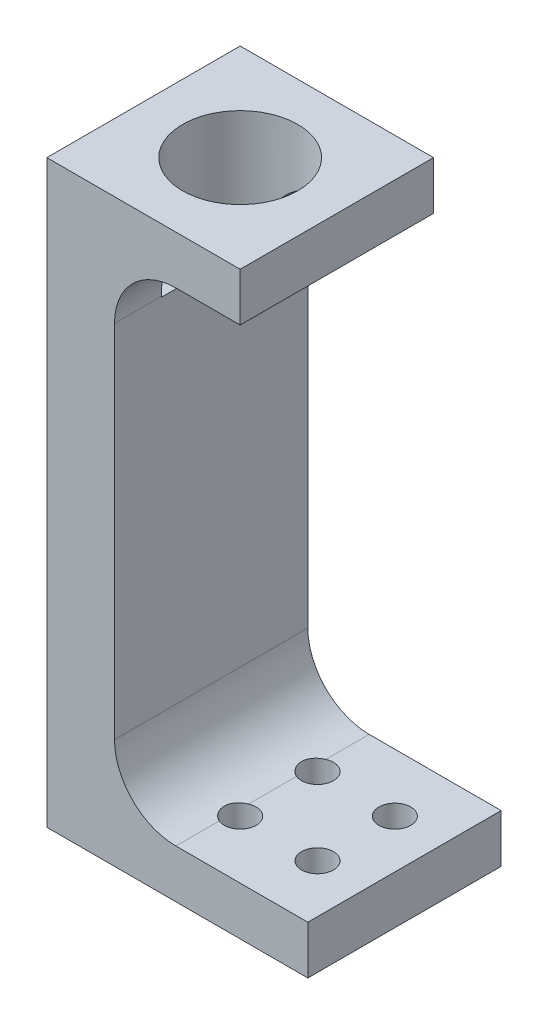
ISO-10303-21;
HEADER;
FILE_DESCRIPTION(('STEP AP214'),'2;1');
FILE_NAME('part.step','',(''),(''),'','','');
FILE_SCHEMA(('AUTOMOTIVE_DESIGN { 1 0 10303 214 1 1 1 1 }'));
ENDSEC;
DATA;
#1=APPLICATION_CONTEXT('core data for automotive mechanical design processes');
#2=APPLICATION_PROTOCOL_DEFINITION('international standard','automotive_design',2000,#1);
#3=PRODUCT_CONTEXT('',#1,'mechanical');
#4=PRODUCT('Part','Part','',(#3));
#5=PRODUCT_RELATED_PRODUCT_CATEGORY('part','',(#4));
#6=PRODUCT_DEFINITION_FORMATION('','',#4);
#7=PRODUCT_DEFINITION_CONTEXT('part definition',#1,'design');
#8=PRODUCT_DEFINITION('design','',#6,#7);
#9=PRODUCT_DEFINITION_SHAPE('','',#8);
#10=(LENGTH_UNIT() NAMED_UNIT(*) SI_UNIT(.MILLI.,.METRE.));
#11=(NAMED_UNIT(*) PLANE_ANGLE_UNIT() SI_UNIT($,.RADIAN.));
#12=(NAMED_UNIT(*) SI_UNIT($,.STERADIAN.) SOLID_ANGLE_UNIT());
#13=UNCERTAINTY_MEASURE_WITH_UNIT(LENGTH_MEASURE(1.E-05),#10,'distance_accuracy_value','');
#14=(GEOMETRIC_REPRESENTATION_CONTEXT(3) GLOBAL_UNCERTAINTY_ASSIGNED_CONTEXT((#13)) GLOBAL_UNIT_ASSIGNED_CONTEXT((#10,
#11,#12)) REPRESENTATION_CONTEXT('',''));
#15=CARTESIAN_POINT('',(0.,0.,0.));
#16=DIRECTION('',(0.,0.,1.));
#17=DIRECTION('',(1.,0.,0.));
#18=AXIS2_PLACEMENT_3D('',#15,#16,#17);
#19=CARTESIAN_POINT('',(7.,4.99999999999999,20.));
#20=DIRECTION('',(-1.,0.,0.));
#21=DIRECTION('',(0.,-1.,0.));
#22=AXIS2_PLACEMENT_3D('',#19,#20,#21);
#23=PLANE('',#22);
#24=DIRECTION('',(0.,1.,0.));
#25=VECTOR('',#24,1.);
#26=CARTESIAN_POINT('',(6.99999999999999,48.57,15.1456301548012));
#27=LINE('',#26,#25);
#28=CARTESIAN_POINT('',(6.99999999999999,48.65,15.1456301548012));
#29=VERTEX_POINT('',#28);
#30=CARTESIAN_POINT('',(6.99999999999999,48.57,15.1456301548012));
#31=VERTEX_POINT('',#30);
#32=EDGE_CURVE('E146',#29,#31,#27,.F.);
#33=ORIENTED_EDGE('',*,*,#32,.F.);
#34=DIRECTION('',(0.,0.,-1.));
#35=VECTOR('',#34,1.);
#36=CARTESIAN_POINT('',(6.99999999999999,48.65,20.));
#37=LINE('',#36,#35);
#38=CARTESIAN_POINT('',(6.99999999999999,48.65,20.));
#39=VERTEX_POINT('',#38);
#40=EDGE_CURVE('E241',#29,#39,#37,.F.);
#41=ORIENTED_EDGE('',*,*,#40,.T.);
#42=DIRECTION('',(0.,1.,0.));
#43=VECTOR('',#42,1.);
#44=CARTESIAN_POINT('',(7.,4.99999999999999,20.));
#45=LINE('',#44,#43);
#46=CARTESIAN_POINT('',(7.,11.35,20.));
#47=VERTEX_POINT('',#46);
#48=EDGE_CURVE('E198',#47,#39,#45,.T.);
#49=ORIENTED_EDGE('',*,*,#48,.F.);
#50=DIRECTION('',(0.,0.,-1.));
#51=VECTOR('',#50,1.);
#52=CARTESIAN_POINT('',(7.,11.35,0.));
#53=LINE('',#52,#51);
#54=CARTESIAN_POINT('',(7.,11.35,0.));
#55=VERTEX_POINT('',#54);
#56=EDGE_CURVE('E243',#47,#55,#53,.T.);
#57=ORIENTED_EDGE('',*,*,#56,.T.);
#58=DIRECTION('',(0.,1.,0.));
#59=VECTOR('',#58,1.);
#60=CARTESIAN_POINT('',(7.,4.99999999999999,0.));
#61=LINE('',#60,#59);
#62=CARTESIAN_POINT('',(6.99999999999999,48.65,0.));
#63=VERTEX_POINT('',#62);
#64=EDGE_CURVE('E217',#55,#63,#61,.T.);
#65=ORIENTED_EDGE('',*,*,#64,.T.);
#66=CARTESIAN_POINT('',(6.99999999999999,48.65,4.85436984519875));
#67=VERTEX_POINT('',#66);
#68=EDGE_CURVE('E163',#63,#67,#37,.F.);
#69=ORIENTED_EDGE('',*,*,#68,.T.);
#70=DIRECTION('',(0.,1.,0.));
#71=VECTOR('',#70,1.);
#72=CARTESIAN_POINT('',(6.99999999999999,48.57,4.85436984519875));
#73=LINE('',#72,#71);
#74=CARTESIAN_POINT('',(6.99999999999999,48.57,4.85436984519875));
#75=VERTEX_POINT('',#74);
#76=EDGE_CURVE('E154',#75,#67,#73,.T.);
#77=ORIENTED_EDGE('',*,*,#76,.F.);
#78=DIRECTION('',(0.,0.,1.));
#79=VECTOR('',#78,1.);
#80=CARTESIAN_POINT('',(6.99999999999999,48.57,20.));
#81=LINE('',#80,#79);
#82=EDGE_CURVE('E11',#75,#31,#81,.T.);
#83=ORIENTED_EDGE('',*,*,#82,.T.);
#84=EDGE_LOOP('',(#33,#41,#49,#57,#65,#69,#77,#83));
#85=FACE_BOUND('',#84,.T.);
#86=ADVANCED_FACE('F39',(#85),#23,.F.);
#87=CARTESIAN_POINT('',(6.99999999999998,55.,20.));
#88=DIRECTION('',(0.,1.,0.));
#89=DIRECTION('',(-1.,0.,0.));
#90=AXIS2_PLACEMENT_3D('',#87,#88,#89);
#91=PLANE('',#90);
#92=CARTESIAN_POINT('',(10.,55.,10.));
#93=DIRECTION('',(0.,1.,0.));
#94=DIRECTION('',(-1.,0.,0.));
#95=AXIS2_PLACEMENT_3D('',#92,#93,#94);
#96=CIRCLE('',#95,5.9563);
#97=CARTESIAN_POINT('',(13.35,55.,5.07506246841646));
#98=VERTEX_POINT('',#97);
#99=CARTESIAN_POINT('',(13.35,55.,14.9249375315835));
#100=VERTEX_POINT('',#99);
#101=EDGE_CURVE('E55',#98,#100,#96,.F.);
#102=ORIENTED_EDGE('',*,*,#101,.F.);
#103=DIRECTION('',(0.,0.,-1.));
#104=VECTOR('',#103,1.);
#105=CARTESIAN_POINT('',(13.35,55.,0.));
#106=LINE('',#105,#104);
#107=CARTESIAN_POINT('',(13.35,55.,0.));
#108=VERTEX_POINT('',#107);
#109=EDGE_CURVE('E250',#98,#108,#106,.T.);
#110=ORIENTED_EDGE('',*,*,#109,.T.);
#111=DIRECTION('',(1.,0.,0.));
#112=VECTOR('',#111,1.);
#113=CARTESIAN_POINT('',(6.99999999999998,55.,0.));
#114=LINE('',#113,#112);
#115=CARTESIAN_POINT('',(20.,55.,0.));
#116=VERTEX_POINT('',#115);
#117=EDGE_CURVE('E219',#108,#116,#114,.T.);
#118=ORIENTED_EDGE('',*,*,#117,.T.);
#119=DIRECTION('',(0.,0.,-1.));
#120=VECTOR('',#119,1.);
#121=CARTESIAN_POINT('',(20.,55.,20.));
#122=LINE('',#121,#120);
#123=CARTESIAN_POINT('',(20.,55.,20.));
#124=VERTEX_POINT('',#123);
#125=EDGE_CURVE('E229',#124,#116,#122,.T.);
#126=ORIENTED_EDGE('',*,*,#125,.F.);
#127=DIRECTION('',(1.,0.,0.));
#128=VECTOR('',#127,1.);
#129=CARTESIAN_POINT('',(6.99999999999998,55.,20.));
#130=LINE('',#129,#128);
#131=CARTESIAN_POINT('',(13.35,55.,20.));
#132=VERTEX_POINT('',#131);
#133=EDGE_CURVE('E201',#132,#124,#130,.T.);
#134=ORIENTED_EDGE('',*,*,#133,.F.);
#135=EDGE_CURVE('E252',#132,#100,#106,.T.);
#136=ORIENTED_EDGE('',*,*,#135,.T.);
#137=EDGE_LOOP('',(#102,#110,#118,#126,#134,#136));
#138=FACE_BOUND('',#137,.T.);
#139=ADVANCED_FACE('F299',(#138),#91,.F.);
#140=CARTESIAN_POINT('',(20.,60.,20.));
#141=DIRECTION('',(0.,-1.,0.));
#142=DIRECTION('',(1.,0.,0.));
#143=AXIS2_PLACEMENT_3D('',#140,#141,#142);
#144=PLANE('',#143);
#145=DIRECTION('',(-1.,0.,0.));
#146=VECTOR('',#145,1.);
#147=CARTESIAN_POINT('',(20.,60.,0.));
#148=LINE('',#147,#146);
#149=CARTESIAN_POINT('',(20.,60.,0.));
#150=VERTEX_POINT('',#149);
#151=CARTESIAN_POINT('',(0.,60.,0.));
#152=VERTEX_POINT('',#151);
#153=EDGE_CURVE('E191',#150,#152,#148,.T.);
#154=ORIENTED_EDGE('',*,*,#153,.T.);
#155=DIRECTION('',(0.,0.,-1.));
#156=VECTOR('',#155,1.);
#157=CARTESIAN_POINT('',(0.,60.,20.));
#158=LINE('',#157,#156);
#159=CARTESIAN_POINT('',(0.,60.,20.));
#160=VERTEX_POINT('',#159);
#161=EDGE_CURVE('E207',#160,#152,#158,.T.);
#162=ORIENTED_EDGE('',*,*,#161,.F.);
#163=DIRECTION('',(-1.,0.,0.));
#164=VECTOR('',#163,1.);
#165=CARTESIAN_POINT('',(20.,60.,20.));
#166=LINE('',#165,#164);
#167=CARTESIAN_POINT('',(20.,60.,20.));
#168=VERTEX_POINT('',#167);
#169=EDGE_CURVE('E205',#168,#160,#166,.T.);
#170=ORIENTED_EDGE('',*,*,#169,.F.);
#171=DIRECTION('',(0.,0.,-1.));
#172=VECTOR('',#171,1.);
#173=CARTESIAN_POINT('',(20.,60.,20.));
#174=LINE('',#173,#172);
#175=EDGE_CURVE('E226',#168,#150,#174,.T.);
#176=ORIENTED_EDGE('',*,*,#175,.T.);
#177=EDGE_LOOP('',(#154,#162,#170,#176));
#178=FACE_BOUND('',#177,.T.);
#179=CARTESIAN_POINT('',(10.,60.,10.));
#180=DIRECTION('',(0.,-1.,0.));
#181=DIRECTION('',(1.,0.,0.));
#182=AXIS2_PLACEMENT_3D('',#179,#180,#181);
#183=CIRCLE('',#182,5.9563);
#184=CARTESIAN_POINT('',(15.9563,60.,10.));
#185=VERTEX_POINT('',#184);
#186=EDGE_CURVE('E158',#185,#185,#183,.T.);
#187=ORIENTED_EDGE('',*,*,#186,.T.);
#188=EDGE_LOOP('',(#187));
#189=FACE_BOUND('',#188,.T.);
#190=ADVANCED_FACE('F296',(#178,#189),#144,.F.);
#191=CARTESIAN_POINT('',(13.35,48.65,20.));
#192=DIRECTION('',(0.,0.,1.));
#193=DIRECTION('',(1.,0.,0.));
#194=AXIS2_PLACEMENT_3D('',#191,#192,#193);
#195=CYLINDRICAL_SURFACE('',#194,6.35);
#196=CARTESIAN_POINT('',(6.99999999999999,48.65,4.85436984519875));
#197=CARTESIAN_POINT('',(6.9999992818069,48.734454480183,4.85437382577386));
#198=CARTESIAN_POINT('',(7.00168521334198,48.8188965864689,4.85338691640093));
#199=CARTESIAN_POINT('',(7.00841859388008,48.9875958779938,4.8494687045629));
#200=CARTESIAN_POINT('',(7.01346581401016,49.0718530754316,4.84653753448419));
#201=CARTESIAN_POINT('',(7.03361686742175,49.3239340088723,4.83489229298772));
#202=CARTESIAN_POINT('',(7.05373015348571,49.4912589255421,4.82332632552397));
#203=CARTESIAN_POINT('',(7.10687434563199,49.8220868973223,4.79344204231649));
#204=CARTESIAN_POINT('',(7.13982206507667,49.9856075190962,4.7751672529984));
#205=CARTESIAN_POINT('',(7.21825854542084,50.3088917354404,4.73298904051804));
#206=CARTESIAN_POINT('',(7.26374977243069,50.4686545845053,4.70908451065825));
#207=CARTESIAN_POINT('',(7.36668367067238,50.782998671125,4.65711119202545));
#208=CARTESIAN_POINT('',(7.42408738025659,50.9375949391291,4.62905606224884));
#209=CARTESIAN_POINT('',(7.55048283558707,51.2413697435556,4.5702451525967));
#210=CARTESIAN_POINT('',(7.61947421940112,51.3905484490144,4.53948945708561));
#211=CARTESIAN_POINT('',(7.84373612325595,51.8298907184806,4.44533189534096));
#212=CARTESIAN_POINT('',(8.01610076559751,52.1112719198209,4.38014754637957));
#213=CARTESIAN_POINT('',(8.31559118238781,52.5242699177789,4.28574875498484));
#214=CARTESIAN_POINT('',(8.42802291932234,52.6661617167889,4.25357824125725));
#215=CARTESIAN_POINT('',(8.66511880533711,52.9403582608421,4.19392359825515));
#216=CARTESIAN_POINT('',(8.78977604980311,53.0726683447891,4.16643684746755));
#217=CARTESIAN_POINT('',(9.05046554884871,53.3264899193993,4.11838144502198));
#218=CARTESIAN_POINT('',(9.18647856172476,53.4480189849129,4.09780137598122));
#219=CARTESIAN_POINT('',(9.46910842533944,53.6793621164603,4.06570453008208));
#220=CARTESIAN_POINT('',(9.61572070097367,53.7891811869736,4.05418386799323));
#221=CARTESIAN_POINT('',(9.87712368402315,53.9678435000316,4.04394602934627));
#222=CARTESIAN_POINT('',(9.98975236189021,54.039718829302,4.0426026792437));
#223=CARTESIAN_POINT('',(10.2192214109353,54.1761676910057,4.04663039633971));
#224=CARTESIAN_POINT('',(10.3360607461816,54.2407430034773,4.05199982282513));
#225=CARTESIAN_POINT('',(10.5730406303461,54.3621545516148,4.07013953411893));
#226=CARTESIAN_POINT('',(10.6931787747318,54.4189962533814,4.08290455782465));
#227=CARTESIAN_POINT('',(10.9358491683956,54.5246819626474,4.11640449964877));
#228=CARTESIAN_POINT('',(11.0583814333875,54.5735259176341,4.13713947009435));
#229=CARTESIAN_POINT('',(11.3051530550616,54.6631849806003,4.18708459611786));
#230=CARTESIAN_POINT('',(11.4293968465244,54.7039717712157,4.2163237806148));
#231=CARTESIAN_POINT('',(11.6779841797432,54.7772879711057,4.28349265920988));
#232=CARTESIAN_POINT('',(11.8023277284144,54.809816747291,4.32142301918102));
#233=CARTESIAN_POINT('',(12.0499197149432,54.8667863964496,4.40603386067028));
#234=CARTESIAN_POINT('',(12.173167860181,54.8912251679658,4.45271661078145));
#235=CARTESIAN_POINT('',(12.4173272749561,54.9323521653639,4.55467709352206));
#236=CARTESIAN_POINT('',(12.5382392843055,54.9490428847888,4.60995205327936));
#237=CARTESIAN_POINT('',(12.7770495869897,54.9752422496074,4.72900939383525));
#238=CARTESIAN_POINT('',(12.8949376407935,54.9847289841821,4.79281704004379));
#239=CARTESIAN_POINT('',(13.1260732991677,54.997107382183,4.92820121553793));
#240=CARTESIAN_POINT('',(13.2393332857689,55.0000179530465,4.99975485074903));
#241=CARTESIAN_POINT('',(13.35,55.,5.07506246841646));
#242=B_SPLINE_CURVE_WITH_KNOTS('',3,(#196,#197,#198,#199,#200,#201,#202,#203,#204,#205,#206,
#207,#208,#209,#210,#211,#212,#213,#214,#215,#216,#217,#218,#219,#220,#221,#222,#223,#224,#225,
#226,#227,#228,#229,#230,#231,#232,#233,#234,#235,#236,#237,#238,#239,#240,#241),.UNSPECIFIED.,
.F.,.F.,(4,2,2,2,2,2,2,2,2,2,2,2,2,2,2,2,2,2,2,2,2,2,4),(0.,0.253316575456899,0.506615904140768,
1.0126412431812,1.51543992576807,2.01833753142284,2.51961554696975,3.02087790838916,
4.02527057063263,4.57633949443016,5.12709896328156,5.67694343881885,6.22655197845441,
6.62700548345487,7.02736113015535,7.42743231972265,7.82750613602755,8.2289619513529,
8.63044853444076,9.03203932586536,9.43350078421848,9.83617844472714,10.237696866458),.UNSPECIFIED.);
#243=EDGE_CURVE('E48',#67,#98,#242,.T.);
#244=ORIENTED_EDGE('',*,*,#243,.F.);
#245=ORIENTED_EDGE('',*,*,#68,.F.);
#246=CARTESIAN_POINT('',(13.35,48.65,0.));
#247=DIRECTION('',(0.,0.,1.));
#248=DIRECTION('',(1.,0.,0.));
#249=AXIS2_PLACEMENT_3D('',#246,#247,#248);
#250=CIRCLE('',#249,6.35);
#251=EDGE_CURVE('E259',#108,#63,#250,.T.);
#252=ORIENTED_EDGE('',*,*,#251,.F.);
#253=ORIENTED_EDGE('',*,*,#109,.F.);
#254=EDGE_LOOP('',(#244,#245,#252,#253));
#255=FACE_BOUND('',#254,.T.);
#256=ADVANCED_FACE('F41',(#255),#195,.F.);
#257=CARTESIAN_POINT('',(13.35,55.,14.9249375315835));
#258=CARTESIAN_POINT('',(13.2417949174794,55.0000162019935,14.9985678116028));
#259=CARTESIAN_POINT('',(13.1311134026766,54.9972345918233,15.0686104817718));
#260=CARTESIAN_POINT('',(12.9055901612611,54.9854322347202,15.2011630689163));
#261=CARTESIAN_POINT('',(12.7907466923462,54.9764088455465,15.263669782642));
#262=CARTESIAN_POINT('',(12.55793885043,54.9514947506645,15.3806527279947));
#263=CARTESIAN_POINT('',(12.4399787915691,54.9356131143532,15.4351394381821));
#264=CARTESIAN_POINT('',(12.2018144356329,54.8964970386236,15.5359040125943));
#265=CARTESIAN_POINT('',(12.0816105565694,54.8732639561269,15.5821833892617));
#266=CARTESIAN_POINT('',(11.8396412374644,54.8190142263409,15.6665420182595));
#267=CARTESIAN_POINT('',(11.717872083633,54.7879734088744,15.7045951116447));
#268=CARTESIAN_POINT('',(11.474284801046,54.7179692699601,15.7723458215646));
#269=CARTESIAN_POINT('',(11.3524666713091,54.6790057809578,15.8020432613561));
#270=CARTESIAN_POINT('',(11.1100174659119,54.5931894782194,15.8532649989088));
#271=CARTESIAN_POINT('',(10.9893854981637,54.5463431648759,15.8747959837317));
#272=CARTESIAN_POINT('',(10.7502777686248,54.4448954133534,15.9100930899273));
#273=CARTESIAN_POINT('',(10.6318019617612,54.3902941374967,15.9238593737961));
#274=CARTESIAN_POINT('',(10.4008815793871,54.2750714518228,15.9438957672316));
#275=CARTESIAN_POINT('',(10.288360273245,54.2146344514353,15.950344506248));
#276=CARTESIAN_POINT('',(10.0670185167519,54.0869918700337,15.9569534528279));
#277=CARTESIAN_POINT('',(9.95819927744278,54.0197841020719,15.9571116219757));
#278=CARTESIAN_POINT('',(9.63823344218495,53.8085370455451,15.9491256743923));
#279=CARTESIAN_POINT('',(9.43354787647312,53.6548585981865,15.9325234091887));
#280=CARTESIAN_POINT('',(9.02141167806378,53.3048685302846,15.8794830915766));
#281=CARTESIAN_POINT('',(8.81675672792482,53.1056341806975,15.8408435280425));
#282=CARTESIAN_POINT('',(8.43705609531787,52.6831553758961,15.7508989996484));
#283=CARTESIAN_POINT('',(8.26204097928048,52.4598865181385,15.6995810925449));
#284=CARTESIAN_POINT('',(7.91198591370131,51.9462369520259,15.5819560217847));
#285=CARTESIAN_POINT('',(7.74382175067395,51.6513271113247,15.5146943496053));
#286=CARTESIAN_POINT('',(7.52816949881339,51.1911660344398,15.4197535027577));
#287=CARTESIAN_POINT('',(7.46238882162065,51.0348282927673,15.3891010663744));
#288=CARTESIAN_POINT('',(7.34337654489241,50.7168211236099,15.3314383478984));
#289=CARTESIAN_POINT('',(7.2901383876934,50.5551545328588,15.3044261657309));
#290=CARTESIAN_POINT('',(7.20342606481345,50.2510593340629,15.259155792072));
#291=CARTESIAN_POINT('',(7.16820716202913,50.1092294095419,15.2401965692966));
#292=CARTESIAN_POINT('',(7.10756036662683,49.8229650172745,15.2069657921929));
#293=CARTESIAN_POINT('',(7.08213045788458,49.6785310922654,15.1926932726885));
#294=CARTESIAN_POINT('',(7.04122809045242,49.3872803209051,15.1695036115901));
#295=CARTESIAN_POINT('',(7.02579266665307,49.2404566552615,15.1606063964189));
#296=CARTESIAN_POINT('',(7.00516570869564,48.9457625093556,15.1486409423826));
#297=CARTESIAN_POINT('',(6.99998083987864,48.7978914106724,15.145576496277));
#298=CARTESIAN_POINT('',(6.99999999999998,48.65,15.1456301548013));
#299=B_SPLINE_CURVE_WITH_KNOTS('',3,(#257,#258,#259,#260,#261,#262,#263,#264,#265,#266,#267,
#268,#269,#270,#271,#272,#273,#274,#275,#276,#277,#278,#279,#280,#281,#282,#283,#284,#285,#286,
#287,#288,#289,#290,#291,#292,#293,#294,#295,#296,#297,#298),.UNSPECIFIED.,.F.,.F.,(4,2,2,2,2,2,
2,2,2,2,2,2,2,2,2,2,2,2,2,2,4),(0.,0.392584493478463,0.785335275786889,1.17756826442515,
1.56972889732697,1.96311880190909,2.35651702705993,2.74959242095531,3.14265958844043,
3.52590994817343,3.90928449651873,4.67593099230418,5.53750267217242,6.39995751797447,
7.43341989189718,7.95005518142611,8.46641975370698,8.90811457084752,9.34971836855322,
9.79294931818256,10.2364683805113),.UNSPECIFIED.);
#300=EDGE_CURVE('E151',#100,#29,#299,.T.);
#301=ORIENTED_EDGE('',*,*,#300,.F.);
#302=ORIENTED_EDGE('',*,*,#135,.F.);
#303=CARTESIAN_POINT('',(13.35,48.65,20.));
#304=DIRECTION('',(0.,0.,1.));
#305=DIRECTION('',(1.,0.,0.));
#306=AXIS2_PLACEMENT_3D('',#303,#304,#305);
#307=CIRCLE('',#306,6.35);
#308=EDGE_CURVE('E261',#39,#132,#307,.F.);
#309=ORIENTED_EDGE('',*,*,#308,.F.);
#310=ORIENTED_EDGE('',*,*,#40,.F.);
#311=EDGE_LOOP('',(#301,#302,#309,#310));
#312=FACE_BOUND('',#311,.T.);
#313=ADVANCED_FACE('F322',(#312),#195,.F.);
#314=CARTESIAN_POINT('',(0.,60.,20.));
#315=DIRECTION('',(1.,0.,0.));
#316=DIRECTION('',(0.,0.,-1.));
#317=AXIS2_PLACEMENT_3D('',#314,#315,#316);
#318=PLANE('',#317);
#319=DIRECTION('',(0.,-1.,0.));
#320=VECTOR('',#319,1.);
#321=CARTESIAN_POINT('',(0.,60.,0.));
#322=LINE('',#321,#320);
#323=CARTESIAN_POINT('',(0.,0.,0.));
#324=VERTEX_POINT('',#323);
#325=EDGE_CURVE('E186',#152,#324,#322,.T.);
#326=ORIENTED_EDGE('',*,*,#325,.T.);
#327=DIRECTION('',(0.,0.,-1.));
#328=VECTOR('',#327,1.);
#329=CARTESIAN_POINT('',(0.,0.,20.));
#330=LINE('',#329,#328);
#331=CARTESIAN_POINT('',(0.,0.,20.));
#332=VERTEX_POINT('',#331);
#333=EDGE_CURVE('E238',#332,#324,#330,.T.);
#334=ORIENTED_EDGE('',*,*,#333,.F.);
#335=DIRECTION('',(0.,-1.,0.));
#336=VECTOR('',#335,1.);
#337=CARTESIAN_POINT('',(0.,60.,20.));
#338=LINE('',#337,#336);
#339=EDGE_CURVE('E187',#160,#332,#338,.T.);
#340=ORIENTED_EDGE('',*,*,#339,.F.);
#341=ORIENTED_EDGE('',*,*,#161,.T.);
#342=EDGE_LOOP('',(#326,#334,#340,#341));
#343=FACE_BOUND('',#342,.T.);
#344=ADVANCED_FACE('F319',(#343),#318,.F.);
#345=CARTESIAN_POINT('',(0.,0.,20.));
#346=DIRECTION('',(0.,1.,0.));
#347=DIRECTION('',(0.,0.,1.));
#348=AXIS2_PLACEMENT_3D('',#345,#346,#347);
#349=PLANE('',#348);
#350=CARTESIAN_POINT('',(22.,0.,14.));
#351=DIRECTION('',(0.,-1.,0.));
#352=DIRECTION('',(0.,0.,-1.));
#353=AXIS2_PLACEMENT_3D('',#350,#351,#352);
#354=CIRCLE('',#353,1.64999999999999);
#355=CARTESIAN_POINT('',(22.,0.,12.35));
#356=VERTEX_POINT('',#355);
#357=EDGE_CURVE('E165',#356,#356,#354,.T.);
#358=ORIENTED_EDGE('',*,*,#357,.F.);
#359=EDGE_LOOP('',(#358));
#360=FACE_BOUND('',#359,.T.);
#361=CARTESIAN_POINT('',(22.,0.,6.));
#362=DIRECTION('',(0.,-1.,0.));
#363=DIRECTION('',(0.,0.,-1.));
#364=AXIS2_PLACEMENT_3D('',#361,#362,#363);
#365=CIRCLE('',#364,1.64999999999999);
#366=CARTESIAN_POINT('',(22.,0.,4.35000000000001));
#367=VERTEX_POINT('',#366);
#368=EDGE_CURVE('E172',#367,#367,#365,.T.);
#369=ORIENTED_EDGE('',*,*,#368,.F.);
#370=EDGE_LOOP('',(#369));
#371=FACE_BOUND('',#370,.T.);
#372=CARTESIAN_POINT('',(14.,0.,6.));
#373=DIRECTION('',(0.,-1.,0.));
#374=DIRECTION('',(0.,0.,-1.));
#375=AXIS2_PLACEMENT_3D('',#372,#373,#374);
#376=CIRCLE('',#375,1.64999999999999);
#377=CARTESIAN_POINT('',(14.,0.,4.35000000000001));
#378=VERTEX_POINT('',#377);
#379=EDGE_CURVE('E176',#378,#378,#376,.T.);
#380=ORIENTED_EDGE('',*,*,#379,.F.);
#381=EDGE_LOOP('',(#380));
#382=FACE_BOUND('',#381,.T.);
#383=CARTESIAN_POINT('',(14.,0.,14.));
#384=DIRECTION('',(0.,-1.,0.));
#385=DIRECTION('',(0.,0.,-1.));
#386=AXIS2_PLACEMENT_3D('',#383,#384,#385);
#387=CIRCLE('',#386,1.64999999999999);
#388=CARTESIAN_POINT('',(14.,0.,12.35));
#389=VERTEX_POINT('',#388);
#390=EDGE_CURVE('E180',#389,#389,#387,.T.);
#391=ORIENTED_EDGE('',*,*,#390,.F.);
#392=EDGE_LOOP('',(#391));
#393=FACE_BOUND('',#392,.T.);
#394=DIRECTION('',(1.,0.,0.));
#395=VECTOR('',#394,1.);
#396=CARTESIAN_POINT('',(0.,0.,0.));
#397=LINE('',#396,#395);
#398=CARTESIAN_POINT('',(27.,0.,0.));
#399=VERTEX_POINT('',#398);
#400=EDGE_CURVE('E210',#324,#399,#397,.T.);
#401=ORIENTED_EDGE('',*,*,#400,.T.);
#402=DIRECTION('',(0.,0.,-1.));
#403=VECTOR('',#402,1.);
#404=CARTESIAN_POINT('',(27.,0.,20.));
#405=LINE('',#404,#403);
#406=CARTESIAN_POINT('',(27.,0.,20.));
#407=VERTEX_POINT('',#406);
#408=EDGE_CURVE('E235',#407,#399,#405,.T.);
#409=ORIENTED_EDGE('',*,*,#408,.F.);
#410=DIRECTION('',(1.,0.,0.));
#411=VECTOR('',#410,1.);
#412=CARTESIAN_POINT('',(0.,0.,20.));
#413=LINE('',#412,#411);
#414=EDGE_CURVE('E190',#332,#407,#413,.T.);
#415=ORIENTED_EDGE('',*,*,#414,.F.);
#416=ORIENTED_EDGE('',*,*,#333,.T.);
#417=EDGE_LOOP('',(#401,#409,#415,#416));
#418=FACE_BOUND('',#417,.T.);
#419=ADVANCED_FACE('F316',(#360,#371,#382,#393,#418),#349,.F.);
#420=CARTESIAN_POINT('',(27.,0.,20.));
#421=DIRECTION('',(-1.,0.,0.));
#422=DIRECTION('',(0.,-1.,0.));
#423=AXIS2_PLACEMENT_3D('',#420,#421,#422);
#424=PLANE('',#423);
#425=DIRECTION('',(0.,1.,0.));
#426=VECTOR('',#425,1.);
#427=CARTESIAN_POINT('',(27.,0.,0.));
#428=LINE('',#427,#426);
#429=CARTESIAN_POINT('',(27.,5.,0.));
#430=VERTEX_POINT('',#429);
#431=EDGE_CURVE('E212',#399,#430,#428,.T.);
#432=ORIENTED_EDGE('',*,*,#431,.T.);
#433=DIRECTION('',(0.,0.,-1.));
#434=VECTOR('',#433,1.);
#435=CARTESIAN_POINT('',(27.,5.,20.));
#436=LINE('',#435,#434);
#437=CARTESIAN_POINT('',(27.,5.,20.));
#438=VERTEX_POINT('',#437);
#439=EDGE_CURVE('E232',#438,#430,#436,.T.);
#440=ORIENTED_EDGE('',*,*,#439,.F.);
#441=DIRECTION('',(0.,1.,0.));
#442=VECTOR('',#441,1.);
#443=CARTESIAN_POINT('',(27.,0.,20.));
#444=LINE('',#443,#442);
#445=EDGE_CURVE('E193',#407,#438,#444,.T.);
#446=ORIENTED_EDGE('',*,*,#445,.F.);
#447=ORIENTED_EDGE('',*,*,#408,.T.);
#448=EDGE_LOOP('',(#432,#440,#446,#447));
#449=FACE_BOUND('',#448,.T.);
#450=ADVANCED_FACE('F312',(#449),#424,.F.);
#451=CARTESIAN_POINT('',(27.,5.,20.));
#452=DIRECTION('',(0.,-1.,0.));
#453=DIRECTION('',(1.,0.,0.));
#454=AXIS2_PLACEMENT_3D('',#451,#452,#453);
#455=PLANE('',#454);
#456=CARTESIAN_POINT('',(22.,5.,14.));
#457=DIRECTION('',(0.,-1.,0.));
#458=DIRECTION('',(1.,0.,0.));
#459=AXIS2_PLACEMENT_3D('',#456,#457,#458);
#460=CIRCLE('',#459,1.65);
#461=CARTESIAN_POINT('',(23.65,5.,14.));
#462=VERTEX_POINT('',#461);
#463=EDGE_CURVE('E168',#462,#462,#460,.T.);
#464=ORIENTED_EDGE('',*,*,#463,.T.);
#465=EDGE_LOOP('',(#464));
#466=FACE_BOUND('',#465,.T.);
#467=CARTESIAN_POINT('',(22.,5.,6.));
#468=DIRECTION('',(0.,-1.,0.));
#469=DIRECTION('',(1.,0.,0.));
#470=AXIS2_PLACEMENT_3D('',#467,#468,#469);
#471=CIRCLE('',#470,1.65);
#472=CARTESIAN_POINT('',(23.65,5.,6.));
#473=VERTEX_POINT('',#472);
#474=EDGE_CURVE('E175',#473,#473,#471,.T.);
#475=ORIENTED_EDGE('',*,*,#474,.T.);
#476=EDGE_LOOP('',(#475));
#477=FACE_BOUND('',#476,.T.);
#478=DIRECTION('',(0.,0.,-1.));
#479=VECTOR('',#478,1.);
#480=CARTESIAN_POINT('',(13.35,5.,20.));
#481=LINE('',#480,#479);
#482=CARTESIAN_POINT('',(13.35,5.,0.));
#483=VERTEX_POINT('',#482);
#484=CARTESIAN_POINT('',(13.35,5.,4.4834249111897));
#485=VERTEX_POINT('',#484);
#486=EDGE_CURVE('E247',#483,#485,#481,.F.);
#487=ORIENTED_EDGE('',*,*,#486,.T.);
#488=CARTESIAN_POINT('',(14.,5.,6.));
#489=DIRECTION('',(0.,-1.,0.));
#490=DIRECTION('',(1.,0.,0.));
#491=AXIS2_PLACEMENT_3D('',#488,#489,#490);
#492=CIRCLE('',#491,1.65);
#493=CARTESIAN_POINT('',(13.35,5.,7.5165750888103));
#494=VERTEX_POINT('',#493);
#495=EDGE_CURVE('E62',#485,#494,#492,.T.);
#496=ORIENTED_EDGE('',*,*,#495,.T.);
#497=CARTESIAN_POINT('',(13.35,5.,12.4834249111897));
#498=VERTEX_POINT('',#497);
#499=EDGE_CURVE('E251',#494,#498,#481,.F.);
#500=ORIENTED_EDGE('',*,*,#499,.T.);
#501=CARTESIAN_POINT('',(14.,5.,14.));
#502=DIRECTION('',(0.,-1.,0.));
#503=DIRECTION('',(1.,0.,0.));
#504=AXIS2_PLACEMENT_3D('',#501,#502,#503);
#505=CIRCLE('',#504,1.65);
#506=CARTESIAN_POINT('',(13.35,5.,15.5165750888103));
#507=VERTEX_POINT('',#506);
#508=EDGE_CURVE('E183',#498,#507,#505,.T.);
#509=ORIENTED_EDGE('',*,*,#508,.T.);
#510=CARTESIAN_POINT('',(13.35,5.,20.));
#511=VERTEX_POINT('',#510);
#512=EDGE_CURVE('E246',#507,#511,#481,.F.);
#513=ORIENTED_EDGE('',*,*,#512,.T.);
#514=DIRECTION('',(-1.,0.,0.));
#515=VECTOR('',#514,1.);
#516=CARTESIAN_POINT('',(27.,5.,20.));
#517=LINE('',#516,#515);
#518=EDGE_CURVE('E195',#438,#511,#517,.T.);
#519=ORIENTED_EDGE('',*,*,#518,.F.);
#520=ORIENTED_EDGE('',*,*,#439,.T.);
#521=DIRECTION('',(-1.,0.,0.));
#522=VECTOR('',#521,1.);
#523=CARTESIAN_POINT('',(27.,5.,0.));
#524=LINE('',#523,#522);
#525=EDGE_CURVE('E214',#430,#483,#524,.T.);
#526=ORIENTED_EDGE('',*,*,#525,.T.);
#527=EDGE_LOOP('',(#487,#496,#500,#509,#513,#519,#520,#526));
#528=FACE_BOUND('',#527,.T.);
#529=ADVANCED_FACE('F303',(#466,#477,#528),#455,.F.);
#530=CARTESIAN_POINT('',(20.,55.,20.));
#531=DIRECTION('',(-1.,0.,0.));
#532=DIRECTION('',(0.,-1.,0.));
#533=AXIS2_PLACEMENT_3D('',#530,#531,#532);
#534=PLANE('',#533);
#535=DIRECTION('',(0.,1.,0.));
#536=VECTOR('',#535,1.);
#537=CARTESIAN_POINT('',(20.,55.,0.));
#538=LINE('',#537,#536);
#539=EDGE_CURVE('E221',#116,#150,#538,.T.);
#540=ORIENTED_EDGE('',*,*,#539,.T.);
#541=ORIENTED_EDGE('',*,*,#175,.F.);
#542=DIRECTION('',(0.,1.,0.));
#543=VECTOR('',#542,1.);
#544=CARTESIAN_POINT('',(20.,55.,20.));
#545=LINE('',#544,#543);
#546=EDGE_CURVE('E203',#124,#168,#545,.T.);
#547=ORIENTED_EDGE('',*,*,#546,.F.);
#548=ORIENTED_EDGE('',*,*,#125,.T.);
#549=EDGE_LOOP('',(#540,#541,#547,#548));
#550=FACE_BOUND('',#549,.T.);
#551=ADVANCED_FACE('F291',(#550),#534,.F.);
#552=CARTESIAN_POINT('',(0.,0.,20.));
#553=DIRECTION('',(0.,0.,1.));
#554=DIRECTION('',(1.,0.,0.));
#555=AXIS2_PLACEMENT_3D('',#552,#553,#554);
#556=PLANE('',#555);
#557=ORIENTED_EDGE('',*,*,#339,.T.);
#558=ORIENTED_EDGE('',*,*,#414,.T.);
#559=ORIENTED_EDGE('',*,*,#445,.T.);
#560=ORIENTED_EDGE('',*,*,#518,.T.);
#561=CARTESIAN_POINT('',(13.35,11.35,20.));
#562=DIRECTION('',(0.,0.,1.));
#563=DIRECTION('',(1.,0.,0.));
#564=AXIS2_PLACEMENT_3D('',#561,#562,#563);
#565=CIRCLE('',#564,6.35);
#566=EDGE_CURVE('E257',#511,#47,#565,.F.);
#567=ORIENTED_EDGE('',*,*,#566,.T.);
#568=ORIENTED_EDGE('',*,*,#48,.T.);
#569=ORIENTED_EDGE('',*,*,#308,.T.);
#570=ORIENTED_EDGE('',*,*,#133,.T.);
#571=ORIENTED_EDGE('',*,*,#546,.T.);
#572=ORIENTED_EDGE('',*,*,#169,.T.);
#573=EDGE_LOOP('',(#557,#558,#559,#560,#567,#568,#569,#570,#571,#572));
#574=FACE_BOUND('',#573,.T.);
#575=ADVANCED_FACE('F287',(#574),#556,.T.);
#576=CARTESIAN_POINT('',(0.,0.,0.));
#577=DIRECTION('',(0.,0.,1.));
#578=DIRECTION('',(1.,0.,0.));
#579=AXIS2_PLACEMENT_3D('',#576,#577,#578);
#580=PLANE('',#579);
#581=ORIENTED_EDGE('',*,*,#325,.F.);
#582=ORIENTED_EDGE('',*,*,#153,.F.);
#583=ORIENTED_EDGE('',*,*,#539,.F.);
#584=ORIENTED_EDGE('',*,*,#117,.F.);
#585=ORIENTED_EDGE('',*,*,#251,.T.);
#586=ORIENTED_EDGE('',*,*,#64,.F.);
#587=CARTESIAN_POINT('',(13.35,11.35,0.));
#588=DIRECTION('',(0.,0.,1.));
#589=DIRECTION('',(1.,0.,0.));
#590=AXIS2_PLACEMENT_3D('',#587,#588,#589);
#591=CIRCLE('',#590,6.35);
#592=EDGE_CURVE('E255',#55,#483,#591,.T.);
#593=ORIENTED_EDGE('',*,*,#592,.T.);
#594=ORIENTED_EDGE('',*,*,#525,.F.);
#595=ORIENTED_EDGE('',*,*,#431,.F.);
#596=ORIENTED_EDGE('',*,*,#400,.F.);
#597=EDGE_LOOP('',(#581,#582,#583,#584,#585,#586,#593,#594,#595,#596));
#598=FACE_BOUND('',#597,.T.);
#599=ADVANCED_FACE('F290',(#598),#580,.F.);
#600=CARTESIAN_POINT('',(13.35,11.35,20.));
#601=DIRECTION('',(0.,0.,1.));
#602=DIRECTION('',(1.,0.,0.));
#603=AXIS2_PLACEMENT_3D('',#600,#601,#602);
#604=CYLINDRICAL_SURFACE('',#603,6.35);
#605=ORIENTED_EDGE('',*,*,#499,.F.);
#606=CARTESIAN_POINT('',(13.35,5.,7.5165750888103));
#607=CARTESIAN_POINT('',(13.3075783997158,4.99999813504443,7.498393571229));
#608=CARTESIAN_POINT('',(13.2659423995135,5.00042541752734,7.47844008677001));
#609=CARTESIAN_POINT('',(13.1845041530608,5.00202666646337,7.43512887809842));
#610=CARTESIAN_POINT('',(13.1447015948812,5.00320050539551,7.41177173579735));
#611=CARTESIAN_POINT('',(13.0285808901261,5.00766841559718,7.33690010338066));
#612=CARTESIAN_POINT('',(12.9553675608324,5.01190982439516,7.28050707390452));
#613=CARTESIAN_POINT('',(12.8194516189467,5.0218341996408,7.1564111267227));
#614=CARTESIAN_POINT('',(12.7567486955282,5.02751712344576,7.08870854359504));
#615=CARTESIAN_POINT('',(12.6434782755622,5.03917016477143,6.94382194763318));
#616=CARTESIAN_POINT('',(12.5929112727685,5.04514029396533,6.86663754922123));
#617=CARTESIAN_POINT('',(12.5048634219613,5.05633302702482,6.7040594811342));
#618=CARTESIAN_POINT('',(12.4675205785313,5.06154743026207,6.61859045293615));
#619=CARTESIAN_POINT('',(12.4077259652941,5.0702277616417,6.44250136124557));
#620=CARTESIAN_POINT('',(12.3852743052601,5.07369367689474,6.35188125978628));
#621=CARTESIAN_POINT('',(12.3560447799145,5.07825591527034,6.16869444634481));
#622=CARTESIAN_POINT('',(12.3491655784103,5.07936755552745,6.07614429838997));
#623=CARTESIAN_POINT('',(12.3509959441078,5.0790756789543,5.89120570022062));
#624=CARTESIAN_POINT('',(12.3597047541343,5.07767228428987,5.79881724237032));
#625=CARTESIAN_POINT('',(12.3922982002188,5.07261426793239,5.61764544604427));
#626=CARTESIAN_POINT('',(12.4160524118944,5.06897900193443,5.52883803307486));
#627=CARTESIAN_POINT('',(12.4779140553547,5.06009251688019,5.35646214476883));
#628=CARTESIAN_POINT('',(12.5160218323647,5.05484125895738,5.27289379549617));
#629=CARTESIAN_POINT('',(12.6059116067875,5.0435832075838,5.11256804174273));
#630=CARTESIAN_POINT('',(12.6578086523942,5.03757029120019,5.03587556216672));
#631=CARTESIAN_POINT('',(12.7736872209848,5.02593900601424,4.89222034951867));
#632=CARTESIAN_POINT('',(12.8376679974685,5.02032061286872,4.82525701585815));
#633=CARTESIAN_POINT('',(12.9725384090542,5.01088776362062,4.70597275404157));
#634=CARTESIAN_POINT('',(13.0429192470597,5.00699683983371,4.65308508920624));
#635=CARTESIAN_POINT('',(13.1541292619197,5.00291256233932,4.58262981600815));
#636=CARTESIAN_POINT('',(13.1921702475159,5.00184300892547,4.56061068969515));
#637=CARTESIAN_POINT('',(13.2699035676258,5.00038588223239,4.51966619850566));
#638=CARTESIAN_POINT('',(13.3095962088044,4.99999843618444,4.50074141140332));
#639=CARTESIAN_POINT('',(13.35,5.,4.4834249111897));
#640=B_SPLINE_CURVE_WITH_KNOTS('',3,(#606,#607,#608,#609,#610,#611,#612,#613,#614,#615,#616,
#617,#618,#619,#620,#621,#622,#623,#624,#625,#626,#627,#628,#629,#630,#631,#632,#633,#634,#635,
#636,#637,#638,#639),.UNSPECIFIED.,.F.,.F.,(4,2,2,2,2,2,2,2,2,2,2,2,2,2,2,2,4),(0.,
0.138371744169787,0.276719859098884,0.552828947806732,0.828929869642856,1.10504202283428,
1.38395613865076,1.66287231051188,1.9399681812325,2.21705059260585,2.49176332677023,
2.76648266862145,3.04357025981208,3.32064073887543,3.5837869414151,3.71556131421999,
3.84736026386985),.UNSPECIFIED.);
#641=EDGE_CURVE('E270',#494,#485,#640,.T.);
#642=ORIENTED_EDGE('',*,*,#641,.T.);
#643=ORIENTED_EDGE('',*,*,#486,.F.);
#644=ORIENTED_EDGE('',*,*,#592,.F.);
#645=ORIENTED_EDGE('',*,*,#56,.F.);
#646=ORIENTED_EDGE('',*,*,#566,.F.);
#647=ORIENTED_EDGE('',*,*,#512,.F.);
#648=CARTESIAN_POINT('',(13.35,5.,15.5165750888103));
#649=CARTESIAN_POINT('',(13.3075783997158,4.99999813504443,15.498393571229));
#650=CARTESIAN_POINT('',(13.2659423995135,5.00042541752734,15.47844008677));
#651=CARTESIAN_POINT('',(13.1845041530608,5.00202666646337,15.4351288780984));
#652=CARTESIAN_POINT('',(13.1447015948812,5.00320050539551,15.4117717357974));
#653=CARTESIAN_POINT('',(13.0285808901261,5.00766841559718,15.3369001033807));
#654=CARTESIAN_POINT('',(12.9553675608324,5.01190982439516,15.2805070739045));
#655=CARTESIAN_POINT('',(12.8194516189467,5.0218341996408,15.1564111267227));
#656=CARTESIAN_POINT('',(12.7567486955283,5.02751712344576,15.088708543595));
#657=CARTESIAN_POINT('',(12.6434782755622,5.03917016477143,14.9438219476332));
#658=CARTESIAN_POINT('',(12.5929112727685,5.04514029396533,14.8666375492212));
#659=CARTESIAN_POINT('',(12.5048634219613,5.05633302702482,14.7040594811342));
#660=CARTESIAN_POINT('',(12.4675205785313,5.06154743026207,14.6185904529362));
#661=CARTESIAN_POINT('',(12.4077259652941,5.0702277616417,14.4425013612456));
#662=CARTESIAN_POINT('',(12.3852743052601,5.07369367689474,14.3518812597863));
#663=CARTESIAN_POINT('',(12.3560447799145,5.07825591527034,14.1686944463448));
#664=CARTESIAN_POINT('',(12.3491655784103,5.07936755552745,14.07614429839));
#665=CARTESIAN_POINT('',(12.3509959441078,5.0790756789543,13.8912057002206));
#666=CARTESIAN_POINT('',(12.3597047541343,5.07767228428987,13.7988172423703));
#667=CARTESIAN_POINT('',(12.3922982002188,5.07261426793239,13.6176454460443));
#668=CARTESIAN_POINT('',(12.4160524118944,5.06897900193443,13.5288380330749));
#669=CARTESIAN_POINT('',(12.4779140553547,5.0600925168802,13.3564621447688));
#670=CARTESIAN_POINT('',(12.5160218323647,5.05484125895738,13.2728937954962));
#671=CARTESIAN_POINT('',(12.6059116067875,5.0435832075838,13.1125680417427));
#672=CARTESIAN_POINT('',(12.6578086523942,5.03757029120019,13.0358755621667));
#673=CARTESIAN_POINT('',(12.7736872209848,5.02593900601424,12.8922203495187));
#674=CARTESIAN_POINT('',(12.8376679974685,5.02032061286872,12.8252570158582));
#675=CARTESIAN_POINT('',(12.9725384090541,5.01088776362062,12.7059727540416));
#676=CARTESIAN_POINT('',(13.0429192470597,5.00699683983371,12.6530850892062));
#677=CARTESIAN_POINT('',(13.1541292619197,5.00291256233932,12.5826298160082));
#678=CARTESIAN_POINT('',(13.1921702475159,5.00184300892547,12.5606106896951));
#679=CARTESIAN_POINT('',(13.2699035676258,5.00038588223239,12.5196661985057));
#680=CARTESIAN_POINT('',(13.3095962088044,4.99999843618444,12.5007414114033));
#681=CARTESIAN_POINT('',(13.35,5.,12.4834249111897));
#682=B_SPLINE_CURVE_WITH_KNOTS('',3,(#648,#649,#650,#651,#652,#653,#654,#655,#656,#657,#658,
#659,#660,#661,#662,#663,#664,#665,#666,#667,#668,#669,#670,#671,#672,#673,#674,#675,#676,#677,
#678,#679,#680,#681),.UNSPECIFIED.,.F.,.F.,(4,2,2,2,2,2,2,2,2,2,2,2,2,2,2,2,4),(0.,
0.138371744169787,0.276719859098882,0.55282894780673,0.828929869642855,1.10504202283427,
1.38395613865075,1.66287231051188,1.9399681812325,2.21705059260585,2.49176332677022,
2.76648266862145,3.04357025981208,3.32064073887543,3.5837869414151,3.71556131421999,
3.84736026386985),.UNSPECIFIED.);
#683=EDGE_CURVE('E263',#507,#498,#682,.T.);
#684=ORIENTED_EDGE('',*,*,#683,.T.);
#685=EDGE_LOOP('',(#605,#642,#643,#644,#645,#646,#647,#684));
#686=FACE_BOUND('',#685,.T.);
#687=ADVANCED_FACE('F276',(#686),#604,.F.);
#688=CARTESIAN_POINT('',(14.,0.,14.));
#689=DIRECTION('',(0.,-1.,0.));
#690=DIRECTION('',(0.,0.,-1.));
#691=AXIS2_PLACEMENT_3D('',#688,#689,#690);
#692=CYLINDRICAL_SURFACE('',#691,1.65);
#693=ORIENTED_EDGE('',*,*,#390,.T.);
#694=EDGE_LOOP('',(#693));
#695=FACE_BOUND('',#694,.T.);
#696=ORIENTED_EDGE('',*,*,#683,.F.);
#697=ORIENTED_EDGE('',*,*,#508,.F.);
#698=EDGE_LOOP('',(#696,#697));
#699=FACE_BOUND('',#698,.T.);
#700=ADVANCED_FACE('F279',(#695,#699),#692,.F.);
#701=CARTESIAN_POINT('',(14.,0.,6.));
#702=DIRECTION('',(0.,-1.,0.));
#703=DIRECTION('',(0.,0.,-1.));
#704=AXIS2_PLACEMENT_3D('',#701,#702,#703);
#705=CYLINDRICAL_SURFACE('',#704,1.65);
#706=ORIENTED_EDGE('',*,*,#379,.T.);
#707=EDGE_LOOP('',(#706));
#708=FACE_BOUND('',#707,.T.);
#709=ORIENTED_EDGE('',*,*,#641,.F.);
#710=ORIENTED_EDGE('',*,*,#495,.F.);
#711=EDGE_LOOP('',(#709,#710));
#712=FACE_BOUND('',#711,.T.);
#713=ADVANCED_FACE('F283',(#708,#712),#705,.F.);
#714=CARTESIAN_POINT('',(22.,0.,6.));
#715=DIRECTION('',(0.,-1.,0.));
#716=DIRECTION('',(0.,0.,-1.));
#717=AXIS2_PLACEMENT_3D('',#714,#715,#716);
#718=CYLINDRICAL_SURFACE('',#717,1.65);
#719=ORIENTED_EDGE('',*,*,#368,.T.);
#720=EDGE_LOOP('',(#719));
#721=FACE_BOUND('',#720,.T.);
#722=ORIENTED_EDGE('',*,*,#474,.F.);
#723=EDGE_LOOP('',(#722));
#724=FACE_BOUND('',#723,.T.);
#725=ADVANCED_FACE('F367',(#721,#724),#718,.F.);
#726=CARTESIAN_POINT('',(22.,0.,14.));
#727=DIRECTION('',(0.,-1.,0.));
#728=DIRECTION('',(0.,0.,-1.));
#729=AXIS2_PLACEMENT_3D('',#726,#727,#728);
#730=CYLINDRICAL_SURFACE('',#729,1.65);
#731=ORIENTED_EDGE('',*,*,#357,.T.);
#732=EDGE_LOOP('',(#731));
#733=FACE_BOUND('',#732,.T.);
#734=ORIENTED_EDGE('',*,*,#463,.F.);
#735=EDGE_LOOP('',(#734));
#736=FACE_BOUND('',#735,.T.);
#737=ADVANCED_FACE('F364',(#733,#736),#730,.F.);
#738=CARTESIAN_POINT('',(10.,48.57,10.));
#739=DIRECTION('',(0.,-1.,0.));
#740=DIRECTION('',(1.,0.,0.));
#741=AXIS2_PLACEMENT_3D('',#738,#739,#740);
#742=PLANE('',#741);
#743=CARTESIAN_POINT('',(10.,48.57,10.));
#744=DIRECTION('',(0.,-1.,0.));
#745=DIRECTION('',(1.,0.,0.));
#746=AXIS2_PLACEMENT_3D('',#743,#744,#745);
#747=CIRCLE('',#746,5.9563);
#748=EDGE_CURVE('E149',#31,#75,#747,.T.);
#749=ORIENTED_EDGE('',*,*,#748,.F.);
#750=ORIENTED_EDGE('',*,*,#82,.F.);
#751=EDGE_LOOP('',(#749,#750));
#752=FACE_BOUND('',#751,.T.);
#753=ADVANCED_FACE('F157',(#752),#742,.F.);
#754=CARTESIAN_POINT('',(10.,48.57,10.));
#755=DIRECTION('',(0.,1.,0.));
#756=DIRECTION('',(-1.,0.,0.));
#757=AXIS2_PLACEMENT_3D('',#754,#755,#756);
#758=CYLINDRICAL_SURFACE('',#757,5.9563);
#759=ORIENTED_EDGE('',*,*,#186,.F.);
#760=EDGE_LOOP('',(#759));
#761=FACE_BOUND('',#760,.T.);
#762=ORIENTED_EDGE('',*,*,#76,.T.);
#763=ORIENTED_EDGE('',*,*,#243,.T.);
#764=ORIENTED_EDGE('',*,*,#101,.T.);
#765=ORIENTED_EDGE('',*,*,#300,.T.);
#766=ORIENTED_EDGE('',*,*,#32,.T.);
#767=ORIENTED_EDGE('',*,*,#748,.T.);
#768=EDGE_LOOP('',(#762,#763,#764,#765,#766,#767));
#769=FACE_BOUND('',#768,.T.);
#770=ADVANCED_FACE('F148',(#761,#769),#758,.F.);
#771=CLOSED_SHELL('',(#86,#139,#190,#256,#313,#344,#419,#450,#529,#551,#575,#599,#687,#700,#713,
#725,#737,#753,#770));
#772=MANIFOLD_SOLID_BREP('B2',#771);
#773=ADVANCED_BREP_SHAPE_REPRESENTATION('',(#18,#772),#14);
#774=SHAPE_DEFINITION_REPRESENTATION(#9,#773);
ENDSEC;
END-ISO-10303-21;
